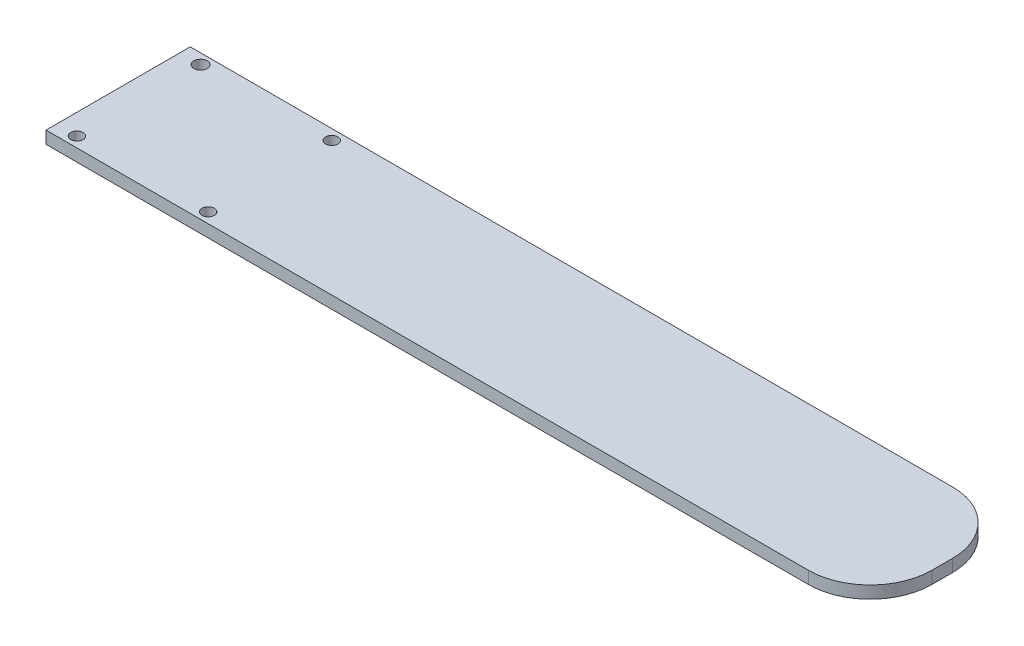
ISO-10303-21;
HEADER;
FILE_DESCRIPTION(('STEP AP214'),'2;1');
FILE_NAME('part.step','',(''),(''),'','','');
FILE_SCHEMA(('AUTOMOTIVE_DESIGN { 1 0 10303 214 1 1 1 1 }'));
ENDSEC;
DATA;
#1=APPLICATION_CONTEXT('core data for automotive mechanical design processes');
#2=APPLICATION_PROTOCOL_DEFINITION('international standard','automotive_design',2000,#1);
#3=PRODUCT_CONTEXT('',#1,'mechanical');
#4=PRODUCT('Part','Part','',(#3));
#5=PRODUCT_RELATED_PRODUCT_CATEGORY('part','',(#4));
#6=PRODUCT_DEFINITION_FORMATION('','',#4);
#7=PRODUCT_DEFINITION_CONTEXT('part definition',#1,'design');
#8=PRODUCT_DEFINITION('design','',#6,#7);
#9=PRODUCT_DEFINITION_SHAPE('','',#8);
#10=(LENGTH_UNIT() NAMED_UNIT(*) SI_UNIT(.MILLI.,.METRE.));
#11=(NAMED_UNIT(*) PLANE_ANGLE_UNIT() SI_UNIT($,.RADIAN.));
#12=(NAMED_UNIT(*) SI_UNIT($,.STERADIAN.) SOLID_ANGLE_UNIT());
#13=UNCERTAINTY_MEASURE_WITH_UNIT(LENGTH_MEASURE(1.E-05),#10,'distance_accuracy_value','');
#14=(GEOMETRIC_REPRESENTATION_CONTEXT(3) GLOBAL_UNCERTAINTY_ASSIGNED_CONTEXT((#13)) GLOBAL_UNIT_ASSIGNED_CONTEXT((#10,
#11,#12)) REPRESENTATION_CONTEXT('',''));
#15=CARTESIAN_POINT('',(0.,0.,0.));
#16=DIRECTION('',(0.,0.,1.));
#17=DIRECTION('',(1.,0.,0.));
#18=AXIS2_PLACEMENT_3D('',#15,#16,#17);
#19=CARTESIAN_POINT('',(-99.9999999999997,3.,17.5));
#20=DIRECTION('',(1.,0.,0.));
#21=DIRECTION('',(0.,0.,-1.));
#22=AXIS2_PLACEMENT_3D('',#19,#20,#21);
#23=PLANE('',#22);
#24=DIRECTION('',(0.,0.,1.));
#25=VECTOR('',#24,1.);
#26=CARTESIAN_POINT('',(-99.9999999999997,0.,17.5));
#27=LINE('',#26,#25);
#28=CARTESIAN_POINT('',(-99.9999999999997,0.,-17.5));
#29=VERTEX_POINT('',#28);
#30=CARTESIAN_POINT('',(-99.9999999999997,0.,17.5));
#31=VERTEX_POINT('',#30);
#32=EDGE_CURVE('E105',#29,#31,#27,.T.);
#33=ORIENTED_EDGE('',*,*,#32,.T.);
#34=DIRECTION('',(0.,-1.,0.));
#35=VECTOR('',#34,1.);
#36=CARTESIAN_POINT('',(-99.9999999999997,3.,17.5));
#37=LINE('',#36,#35);
#38=CARTESIAN_POINT('',(-99.9999999999997,3.,17.5));
#39=VERTEX_POINT('',#38);
#40=EDGE_CURVE('E88',#39,#31,#37,.T.);
#41=ORIENTED_EDGE('',*,*,#40,.F.);
#42=DIRECTION('',(0.,0.,1.));
#43=VECTOR('',#42,1.);
#44=CARTESIAN_POINT('',(-99.9999999999997,3.,17.5));
#45=LINE('',#44,#43);
#46=CARTESIAN_POINT('',(-99.9999999999997,3.,-17.5));
#47=VERTEX_POINT('',#46);
#48=EDGE_CURVE('E93',#47,#39,#45,.T.);
#49=ORIENTED_EDGE('',*,*,#48,.F.);
#50=DIRECTION('',(0.,-1.,0.));
#51=VECTOR('',#50,1.);
#52=CARTESIAN_POINT('',(-99.9999999999997,3.,-17.5));
#53=LINE('',#52,#51);
#54=EDGE_CURVE('E107',#47,#29,#53,.T.);
#55=ORIENTED_EDGE('',*,*,#54,.T.);
#56=EDGE_LOOP('',(#33,#41,#49,#55));
#57=FACE_BOUND('',#56,.T.);
#58=ADVANCED_FACE('F32',(#57),#23,.F.);
#59=CARTESIAN_POINT('',(100.,3.,17.5));
#60=DIRECTION('',(0.,0.,-1.));
#61=DIRECTION('',(-1.,0.,0.));
#62=AXIS2_PLACEMENT_3D('',#59,#60,#61);
#63=PLANE('',#62);
#64=DIRECTION('',(1.,0.,0.));
#65=VECTOR('',#64,1.);
#66=CARTESIAN_POINT('',(100.,0.,17.5));
#67=LINE('',#66,#65);
#68=CARTESIAN_POINT('',(85.0000000000003,0.,17.5));
#69=VERTEX_POINT('',#68);
#70=EDGE_CURVE('E137',#31,#69,#67,.T.);
#71=ORIENTED_EDGE('',*,*,#70,.T.);
#72=DIRECTION('',(0.,-1.,0.));
#73=VECTOR('',#72,1.);
#74=CARTESIAN_POINT('',(85.0000000000003,3.,17.5));
#75=LINE('',#74,#73);
#76=CARTESIAN_POINT('',(85.0000000000003,3.,17.5));
#77=VERTEX_POINT('',#76);
#78=EDGE_CURVE('E11',#69,#77,#75,.F.);
#79=ORIENTED_EDGE('',*,*,#78,.T.);
#80=DIRECTION('',(1.,0.,0.));
#81=VECTOR('',#80,1.);
#82=CARTESIAN_POINT('',(100.,3.,17.5));
#83=LINE('',#82,#81);
#84=EDGE_CURVE('E84',#39,#77,#83,.T.);
#85=ORIENTED_EDGE('',*,*,#84,.F.);
#86=ORIENTED_EDGE('',*,*,#40,.T.);
#87=EDGE_LOOP('',(#71,#79,#85,#86));
#88=FACE_BOUND('',#87,.T.);
#89=ADVANCED_FACE('F86',(#88),#63,.F.);
#90=CARTESIAN_POINT('',(100.,3.,17.5));
#91=DIRECTION('',(-1.,0.,0.));
#92=DIRECTION('',(0.,0.,1.));
#93=AXIS2_PLACEMENT_3D('',#90,#91,#92);
#94=PLANE('',#93);
#95=DIRECTION('',(0.,0.,-1.));
#96=VECTOR('',#95,1.);
#97=CARTESIAN_POINT('',(100.,0.,17.5));
#98=LINE('',#97,#96);
#99=CARTESIAN_POINT('',(100.,0.,2.50000000000004));
#100=VERTEX_POINT('',#99);
#101=CARTESIAN_POINT('',(100.,0.,-2.50000000000001));
#102=VERTEX_POINT('',#101);
#103=EDGE_CURVE('E134',#100,#102,#98,.T.);
#104=ORIENTED_EDGE('',*,*,#103,.T.);
#105=DIRECTION('',(0.,-1.,0.));
#106=VECTOR('',#105,1.);
#107=CARTESIAN_POINT('',(100.,3.,-2.50000000000001));
#108=LINE('',#107,#106);
#109=CARTESIAN_POINT('',(100.,3.,-2.50000000000001));
#110=VERTEX_POINT('',#109);
#111=EDGE_CURVE('E53',#102,#110,#108,.F.);
#112=ORIENTED_EDGE('',*,*,#111,.T.);
#113=DIRECTION('',(0.,0.,-1.));
#114=VECTOR('',#113,1.);
#115=CARTESIAN_POINT('',(100.,3.,17.5));
#116=LINE('',#115,#114);
#117=CARTESIAN_POINT('',(100.,3.,2.50000000000004));
#118=VERTEX_POINT('',#117);
#119=EDGE_CURVE('E92',#118,#110,#116,.T.);
#120=ORIENTED_EDGE('',*,*,#119,.F.);
#121=DIRECTION('',(0.,-1.,0.));
#122=VECTOR('',#121,1.);
#123=CARTESIAN_POINT('',(100.,3.,2.50000000000004));
#124=LINE('',#123,#122);
#125=EDGE_CURVE('E118',#118,#100,#124,.T.);
#126=ORIENTED_EDGE('',*,*,#125,.T.);
#127=EDGE_LOOP('',(#104,#112,#120,#126));
#128=FACE_BOUND('',#127,.T.);
#129=ADVANCED_FACE('F135',(#128),#94,.F.);
#130=CARTESIAN_POINT('',(100.,3.,-17.5));
#131=DIRECTION('',(0.,0.,1.));
#132=DIRECTION('',(1.,0.,0.));
#133=AXIS2_PLACEMENT_3D('',#130,#131,#132);
#134=PLANE('',#133);
#135=DIRECTION('',(-1.,0.,0.));
#136=VECTOR('',#135,1.);
#137=CARTESIAN_POINT('',(100.,3.,-17.5));
#138=LINE('',#137,#136);
#139=CARTESIAN_POINT('',(85.0000000000003,3.,-17.5));
#140=VERTEX_POINT('',#139);
#141=EDGE_CURVE('E98',#140,#47,#138,.T.);
#142=ORIENTED_EDGE('',*,*,#141,.F.);
#143=DIRECTION('',(0.,-1.,0.));
#144=VECTOR('',#143,1.);
#145=CARTESIAN_POINT('',(85.0000000000003,3.,-17.5));
#146=LINE('',#145,#144);
#147=CARTESIAN_POINT('',(85.0000000000003,0.,-17.5));
#148=VERTEX_POINT('',#147);
#149=EDGE_CURVE('E106',#140,#148,#146,.T.);
#150=ORIENTED_EDGE('',*,*,#149,.T.);
#151=DIRECTION('',(-1.,0.,0.));
#152=VECTOR('',#151,1.);
#153=CARTESIAN_POINT('',(100.,0.,-17.5));
#154=LINE('',#153,#152);
#155=EDGE_CURVE('E102',#148,#29,#154,.T.);
#156=ORIENTED_EDGE('',*,*,#155,.T.);
#157=ORIENTED_EDGE('',*,*,#54,.F.);
#158=EDGE_LOOP('',(#142,#150,#156,#157));
#159=FACE_BOUND('',#158,.T.);
#160=ADVANCED_FACE('F127',(#159),#134,.F.);
#161=CARTESIAN_POINT('',(0.,3.,0.));
#162=DIRECTION('',(0.,1.,0.));
#163=DIRECTION('',(0.,0.,1.));
#164=AXIS2_PLACEMENT_3D('',#161,#162,#163);
#165=PLANE('',#164);
#166=CARTESIAN_POINT('',(-63.1439937528606,3.,-15.));
#167=DIRECTION('',(0.,1.,0.));
#168=DIRECTION('',(0.,0.,1.));
#169=AXIS2_PLACEMENT_3D('',#166,#167,#168);
#170=CIRCLE('',#169,1.5);
#171=CARTESIAN_POINT('',(-63.1439937528606,3.,-13.5));
#172=VERTEX_POINT('',#171);
#173=EDGE_CURVE('E150',#172,#172,#170,.T.);
#174=ORIENTED_EDGE('',*,*,#173,.F.);
#175=EDGE_LOOP('',(#174));
#176=FACE_BOUND('',#175,.T.);
#177=CARTESIAN_POINT('',(-63.1439937528606,3.,15.));
#178=DIRECTION('',(0.,1.,0.));
#179=DIRECTION('',(0.,0.,1.));
#180=AXIS2_PLACEMENT_3D('',#177,#178,#179);
#181=CIRCLE('',#180,1.5);
#182=CARTESIAN_POINT('',(-63.1439937528606,3.,16.5));
#183=VERTEX_POINT('',#182);
#184=EDGE_CURVE('E156',#183,#183,#181,.T.);
#185=ORIENTED_EDGE('',*,*,#184,.F.);
#186=EDGE_LOOP('',(#185));
#187=FACE_BOUND('',#186,.T.);
#188=CARTESIAN_POINT('',(-94.9999999999997,3.,15.));
#189=DIRECTION('',(0.,1.,0.));
#190=DIRECTION('',(0.,0.,1.));
#191=AXIS2_PLACEMENT_3D('',#188,#189,#190);
#192=CIRCLE('',#191,1.5);
#193=CARTESIAN_POINT('',(-94.9999999999997,3.,16.5));
#194=VERTEX_POINT('',#193);
#195=EDGE_CURVE('E162',#194,#194,#192,.T.);
#196=ORIENTED_EDGE('',*,*,#195,.F.);
#197=EDGE_LOOP('',(#196));
#198=FACE_BOUND('',#197,.T.);
#199=CARTESIAN_POINT('',(-94.9999999999997,3.,-15.));
#200=DIRECTION('',(0.,1.,0.));
#201=DIRECTION('',(0.,0.,1.));
#202=AXIS2_PLACEMENT_3D('',#199,#200,#201);
#203=CIRCLE('',#202,1.62299852430076);
#204=CARTESIAN_POINT('',(-94.9999999999997,3.,-13.3770014756992));
#205=VERTEX_POINT('',#204);
#206=EDGE_CURVE('E144',#205,#205,#203,.T.);
#207=ORIENTED_EDGE('',*,*,#206,.F.);
#208=EDGE_LOOP('',(#207));
#209=FACE_BOUND('',#208,.T.);
#210=ORIENTED_EDGE('',*,*,#119,.T.);
#211=CARTESIAN_POINT('',(85.0000000000003,3.,-2.50000000000001));
#212=DIRECTION('',(0.,1.,0.));
#213=DIRECTION('',(0.,0.,1.));
#214=AXIS2_PLACEMENT_3D('',#211,#212,#213);
#215=CIRCLE('',#214,15.);
#216=EDGE_CURVE('E40',#110,#140,#215,.T.);
#217=ORIENTED_EDGE('',*,*,#216,.T.);
#218=ORIENTED_EDGE('',*,*,#141,.T.);
#219=ORIENTED_EDGE('',*,*,#48,.T.);
#220=ORIENTED_EDGE('',*,*,#84,.T.);
#221=CARTESIAN_POINT('',(85.0000000000003,3.,2.50000000000004));
#222=DIRECTION('',(0.,1.,0.));
#223=DIRECTION('',(0.,0.,1.));
#224=AXIS2_PLACEMENT_3D('',#221,#222,#223);
#225=CIRCLE('',#224,15.);
#226=EDGE_CURVE('E122',#77,#118,#225,.T.);
#227=ORIENTED_EDGE('',*,*,#226,.T.);
#228=EDGE_LOOP('',(#210,#217,#218,#219,#220,#227));
#229=FACE_BOUND('',#228,.T.);
#230=ADVANCED_FACE('F96',(#176,#187,#198,#209,#229),#165,.T.);
#231=CARTESIAN_POINT('',(0.,0.,0.));
#232=DIRECTION('',(0.,1.,0.));
#233=DIRECTION('',(0.,0.,1.));
#234=AXIS2_PLACEMENT_3D('',#231,#232,#233);
#235=PLANE('',#234);
#236=CARTESIAN_POINT('',(-63.1439937528606,0.,-15.));
#237=DIRECTION('',(0.,1.,0.));
#238=DIRECTION('',(0.,0.,1.));
#239=AXIS2_PLACEMENT_3D('',#236,#237,#238);
#240=CIRCLE('',#239,1.5);
#241=CARTESIAN_POINT('',(-63.1439937528606,0.,-13.5));
#242=VERTEX_POINT('',#241);
#243=EDGE_CURVE('E153',#242,#242,#240,.T.);
#244=ORIENTED_EDGE('',*,*,#243,.T.);
#245=EDGE_LOOP('',(#244));
#246=FACE_BOUND('',#245,.T.);
#247=CARTESIAN_POINT('',(-63.1439937528606,0.,15.));
#248=DIRECTION('',(0.,1.,0.));
#249=DIRECTION('',(0.,0.,1.));
#250=AXIS2_PLACEMENT_3D('',#247,#248,#249);
#251=CIRCLE('',#250,1.5);
#252=CARTESIAN_POINT('',(-63.1439937528606,0.,16.5));
#253=VERTEX_POINT('',#252);
#254=EDGE_CURVE('E159',#253,#253,#251,.T.);
#255=ORIENTED_EDGE('',*,*,#254,.T.);
#256=EDGE_LOOP('',(#255));
#257=FACE_BOUND('',#256,.T.);
#258=CARTESIAN_POINT('',(-94.9999999999997,0.,15.));
#259=DIRECTION('',(0.,1.,0.));
#260=DIRECTION('',(0.,0.,1.));
#261=AXIS2_PLACEMENT_3D('',#258,#259,#260);
#262=CIRCLE('',#261,1.5);
#263=CARTESIAN_POINT('',(-94.9999999999997,0.,16.5));
#264=VERTEX_POINT('',#263);
#265=EDGE_CURVE('E147',#264,#264,#262,.T.);
#266=ORIENTED_EDGE('',*,*,#265,.T.);
#267=EDGE_LOOP('',(#266));
#268=FACE_BOUND('',#267,.T.);
#269=CARTESIAN_POINT('',(-94.9999999999997,0.,-15.));
#270=DIRECTION('',(0.,1.,0.));
#271=DIRECTION('',(0.,0.,1.));
#272=AXIS2_PLACEMENT_3D('',#269,#270,#271);
#273=CIRCLE('',#272,1.62299852430076);
#274=CARTESIAN_POINT('',(-94.9999999999997,0.,-13.3770014756992));
#275=VERTEX_POINT('',#274);
#276=EDGE_CURVE('E141',#275,#275,#273,.T.);
#277=ORIENTED_EDGE('',*,*,#276,.T.);
#278=EDGE_LOOP('',(#277));
#279=FACE_BOUND('',#278,.T.);
#280=ORIENTED_EDGE('',*,*,#155,.F.);
#281=CARTESIAN_POINT('',(85.0000000000003,0.,-2.50000000000001));
#282=DIRECTION('',(0.,1.,0.));
#283=DIRECTION('',(0.,0.,1.));
#284=AXIS2_PLACEMENT_3D('',#281,#282,#283);
#285=CIRCLE('',#284,15.);
#286=EDGE_CURVE('E116',#148,#102,#285,.F.);
#287=ORIENTED_EDGE('',*,*,#286,.T.);
#288=ORIENTED_EDGE('',*,*,#103,.F.);
#289=CARTESIAN_POINT('',(85.0000000000003,0.,2.50000000000004));
#290=DIRECTION('',(0.,1.,0.));
#291=DIRECTION('',(0.,0.,1.));
#292=AXIS2_PLACEMENT_3D('',#289,#290,#291);
#293=CIRCLE('',#292,15.);
#294=EDGE_CURVE('E110',#100,#69,#293,.F.);
#295=ORIENTED_EDGE('',*,*,#294,.T.);
#296=ORIENTED_EDGE('',*,*,#70,.F.);
#297=ORIENTED_EDGE('',*,*,#32,.F.);
#298=EDGE_LOOP('',(#280,#287,#288,#295,#296,#297));
#299=FACE_BOUND('',#298,.T.);
#300=ADVANCED_FACE('F133',(#246,#257,#268,#279,#299),#235,.F.);
#301=CARTESIAN_POINT('',(85.0000000000003,3.,-2.50000000000001));
#302=DIRECTION('',(0.,-1.,0.));
#303=DIRECTION('',(0.,0.,-1.));
#304=AXIS2_PLACEMENT_3D('',#301,#302,#303);
#305=CYLINDRICAL_SURFACE('',#304,15.);
#306=ORIENTED_EDGE('',*,*,#216,.F.);
#307=ORIENTED_EDGE('',*,*,#111,.F.);
#308=ORIENTED_EDGE('',*,*,#286,.F.);
#309=ORIENTED_EDGE('',*,*,#149,.F.);
#310=EDGE_LOOP('',(#306,#307,#308,#309));
#311=FACE_BOUND('',#310,.T.);
#312=ADVANCED_FACE('F130',(#311),#305,.T.);
#313=CARTESIAN_POINT('',(85.0000000000003,3.,2.50000000000004));
#314=DIRECTION('',(0.,-1.,0.));
#315=DIRECTION('',(0.,0.,-1.));
#316=AXIS2_PLACEMENT_3D('',#313,#314,#315);
#317=CYLINDRICAL_SURFACE('',#316,15.);
#318=ORIENTED_EDGE('',*,*,#226,.F.);
#319=ORIENTED_EDGE('',*,*,#78,.F.);
#320=ORIENTED_EDGE('',*,*,#294,.F.);
#321=ORIENTED_EDGE('',*,*,#125,.F.);
#322=EDGE_LOOP('',(#318,#319,#320,#321));
#323=FACE_BOUND('',#322,.T.);
#324=ADVANCED_FACE('F34',(#323),#317,.T.);
#325=CARTESIAN_POINT('',(-94.9999999999997,0.,-15.));
#326=DIRECTION('',(0.,1.,0.));
#327=DIRECTION('',(0.,0.,1.));
#328=AXIS2_PLACEMENT_3D('',#325,#326,#327);
#329=CYLINDRICAL_SURFACE('',#328,1.62299852430076);
#330=ORIENTED_EDGE('',*,*,#276,.F.);
#331=EDGE_LOOP('',(#330));
#332=FACE_BOUND('',#331,.T.);
#333=ORIENTED_EDGE('',*,*,#206,.T.);
#334=EDGE_LOOP('',(#333));
#335=FACE_BOUND('',#334,.T.);
#336=ADVANCED_FACE('F174',(#332,#335),#329,.F.);
#337=CARTESIAN_POINT('',(-94.9999999999997,0.,15.));
#338=DIRECTION('',(0.,1.,0.));
#339=DIRECTION('',(0.,0.,1.));
#340=AXIS2_PLACEMENT_3D('',#337,#338,#339);
#341=CYLINDRICAL_SURFACE('',#340,1.5);
#342=ORIENTED_EDGE('',*,*,#265,.F.);
#343=EDGE_LOOP('',(#342));
#344=FACE_BOUND('',#343,.T.);
#345=ORIENTED_EDGE('',*,*,#195,.T.);
#346=EDGE_LOOP('',(#345));
#347=FACE_BOUND('',#346,.T.);
#348=ADVANCED_FACE('F170',(#344,#347),#341,.F.);
#349=CARTESIAN_POINT('',(-63.1439937528606,0.,15.));
#350=DIRECTION('',(0.,1.,0.));
#351=DIRECTION('',(0.,0.,1.));
#352=AXIS2_PLACEMENT_3D('',#349,#350,#351);
#353=CYLINDRICAL_SURFACE('',#352,1.5);
#354=ORIENTED_EDGE('',*,*,#254,.F.);
#355=EDGE_LOOP('',(#354));
#356=FACE_BOUND('',#355,.T.);
#357=ORIENTED_EDGE('',*,*,#184,.T.);
#358=EDGE_LOOP('',(#357));
#359=FACE_BOUND('',#358,.T.);
#360=ADVANCED_FACE('F173',(#356,#359),#353,.F.);
#361=CARTESIAN_POINT('',(-63.1439937528606,0.,-15.));
#362=DIRECTION('',(0.,1.,0.));
#363=DIRECTION('',(0.,0.,1.));
#364=AXIS2_PLACEMENT_3D('',#361,#362,#363);
#365=CYLINDRICAL_SURFACE('',#364,1.5);
#366=ORIENTED_EDGE('',*,*,#243,.F.);
#367=EDGE_LOOP('',(#366));
#368=FACE_BOUND('',#367,.T.);
#369=ORIENTED_EDGE('',*,*,#173,.T.);
#370=EDGE_LOOP('',(#369));
#371=FACE_BOUND('',#370,.T.);
#372=ADVANCED_FACE('F269',(#368,#371),#365,.F.);
#373=CLOSED_SHELL('',(#58,#89,#129,#160,#230,#300,#312,#324,#336,#348,#360,#372));
#374=MANIFOLD_SOLID_BREP('B2',#373);
#375=ADVANCED_BREP_SHAPE_REPRESENTATION('',(#18,#374),#14);
#376=SHAPE_DEFINITION_REPRESENTATION(#9,#375);
ENDSEC;
END-ISO-10303-21;
